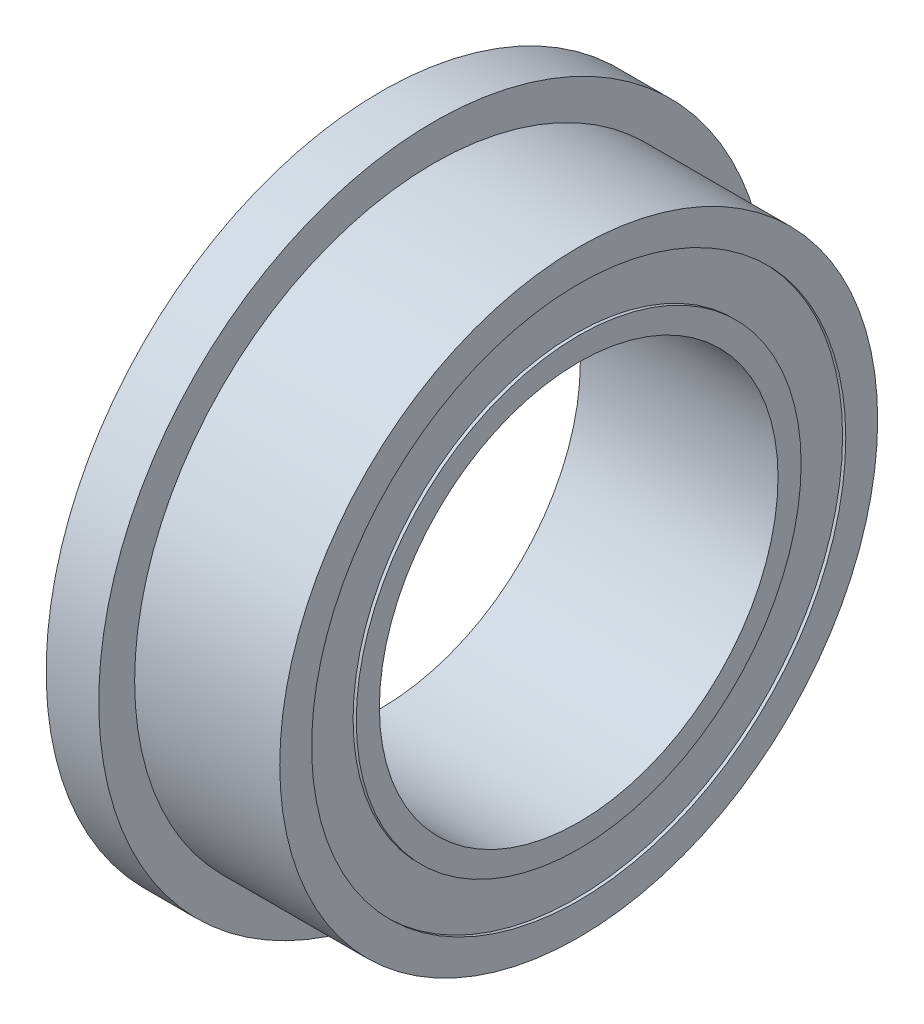
ISO-10303-21;
HEADER;
FILE_DESCRIPTION(('STEP AP214'),'2;1');
FILE_NAME('part.step','',(''),(''),'','','');
FILE_SCHEMA(('AUTOMOTIVE_DESIGN { 1 0 10303 214 1 1 1 1 }'));
ENDSEC;
DATA;
#1=APPLICATION_CONTEXT('core data for automotive mechanical design processes');
#2=APPLICATION_PROTOCOL_DEFINITION('international standard','automotive_design',2000,#1);
#3=PRODUCT_CONTEXT('',#1,'mechanical');
#4=PRODUCT('Part','Part','',(#3));
#5=PRODUCT_RELATED_PRODUCT_CATEGORY('part','',(#4));
#6=PRODUCT_DEFINITION_FORMATION('','',#4);
#7=PRODUCT_DEFINITION_CONTEXT('part definition',#1,'design');
#8=PRODUCT_DEFINITION('design','',#6,#7);
#9=PRODUCT_DEFINITION_SHAPE('','',#8);
#10=(LENGTH_UNIT() NAMED_UNIT(*) SI_UNIT(.MILLI.,.METRE.));
#11=(NAMED_UNIT(*) PLANE_ANGLE_UNIT() SI_UNIT($,.RADIAN.));
#12=(NAMED_UNIT(*) SI_UNIT($,.STERADIAN.) SOLID_ANGLE_UNIT());
#13=UNCERTAINTY_MEASURE_WITH_UNIT(LENGTH_MEASURE(1.E-05),#10,'distance_accuracy_value','');
#14=(GEOMETRIC_REPRESENTATION_CONTEXT(3) GLOBAL_UNCERTAINTY_ASSIGNED_CONTEXT((#13)) GLOBAL_UNIT_ASSIGNED_CONTEXT((#10,
#11,#12)) REPRESENTATION_CONTEXT('',''));
#15=CARTESIAN_POINT('',(0.,0.,0.));
#16=DIRECTION('',(0.,0.,1.));
#17=DIRECTION('',(1.,0.,0.));
#18=AXIS2_PLACEMENT_3D('',#15,#16,#17);
#19=CARTESIAN_POINT('',(3.1496,0.,0.));
#20=DIRECTION('',(1.,0.,0.));
#21=DIRECTION('',(0.,0.,-1.));
#22=AXIS2_PLACEMENT_3D('',#19,#20,#21);
#23=PLANE('',#22);
#24=CARTESIAN_POINT('',(3.1496,0.,0.));
#25=DIRECTION('',(1.,0.,0.));
#26=DIRECTION('',(0.,0.,-1.));
#27=AXIS2_PLACEMENT_3D('',#24,#25,#26);
#28=CIRCLE('',#27,3.175);
#29=CARTESIAN_POINT('',(3.1496,0.,-3.175));
#30=VERTEX_POINT('',#29);
#31=EDGE_CURVE('E60',#30,#30,#28,.T.);
#32=ORIENTED_EDGE('',*,*,#31,.F.);
#33=EDGE_LOOP('',(#32));
#34=FACE_BOUND('',#33,.T.);
#35=CARTESIAN_POINT('',(3.1496,0.,0.));
#36=DIRECTION('',(1.,0.,0.));
#37=DIRECTION('',(0.,0.,-1.));
#38=AXIS2_PLACEMENT_3D('',#35,#36,#37);
#39=CIRCLE('',#38,3.5433);
#40=CARTESIAN_POINT('',(3.1496,0.,-3.5433));
#41=VERTEX_POINT('',#40);
#42=EDGE_CURVE('E92',#41,#41,#39,.T.);
#43=ORIENTED_EDGE('',*,*,#42,.T.);
#44=EDGE_LOOP('',(#43));
#45=FACE_BOUND('',#44,.T.);
#46=ADVANCED_FACE('F45',(#34,#45),#23,.T.);
#47=CARTESIAN_POINT('',(0.,0.,0.));
#48=DIRECTION('',(1.,0.,0.));
#49=DIRECTION('',(0.,0.,-1.));
#50=AXIS2_PLACEMENT_3D('',#47,#48,#49);
#51=PLANE('',#50);
#52=CARTESIAN_POINT('',(0.,0.,0.));
#53=DIRECTION('',(1.,0.,0.));
#54=DIRECTION('',(0.,0.,-1.));
#55=AXIS2_PLACEMENT_3D('',#52,#53,#54);
#56=CIRCLE('',#55,3.175);
#57=CARTESIAN_POINT('',(0.,0.,-3.175));
#58=VERTEX_POINT('',#57);
#59=EDGE_CURVE('E64',#58,#58,#56,.T.);
#60=ORIENTED_EDGE('',*,*,#59,.T.);
#61=EDGE_LOOP('',(#60));
#62=FACE_BOUND('',#61,.T.);
#63=CARTESIAN_POINT('',(0.,0.,0.));
#64=DIRECTION('',(-1.,0.,0.));
#65=DIRECTION('',(0.,0.,1.));
#66=AXIS2_PLACEMENT_3D('',#63,#64,#65);
#67=CIRCLE('',#66,3.5433);
#68=CARTESIAN_POINT('',(0.,0.,3.5433));
#69=VERTEX_POINT('',#68);
#70=EDGE_CURVE('E80',#69,#69,#67,.T.);
#71=ORIENTED_EDGE('',*,*,#70,.T.);
#72=EDGE_LOOP('',(#71));
#73=FACE_BOUND('',#72,.T.);
#74=ADVANCED_FACE('F130',(#62,#73),#51,.F.);
#75=CARTESIAN_POINT('',(0.8382,0.,0.));
#76=DIRECTION('',(-1.,0.,0.));
#77=DIRECTION('',(0.,0.,1.));
#78=AXIS2_PLACEMENT_3D('',#75,#76,#77);
#79=CYLINDRICAL_SURFACE('',#78,5.334);
#80=CARTESIAN_POINT('',(0.8382,0.,0.));
#81=DIRECTION('',(1.,0.,0.));
#82=DIRECTION('',(0.,0.,-1.));
#83=AXIS2_PLACEMENT_3D('',#80,#81,#82);
#84=CIRCLE('',#83,5.334);
#85=CARTESIAN_POINT('',(0.8382,0.,-5.334));
#86=VERTEX_POINT('',#85);
#87=EDGE_CURVE('E53',#86,#86,#84,.T.);
#88=ORIENTED_EDGE('',*,*,#87,.F.);
#89=EDGE_LOOP('',(#88));
#90=FACE_BOUND('',#89,.T.);
#91=CARTESIAN_POINT('',(0.,0.,0.));
#92=DIRECTION('',(1.,0.,0.));
#93=DIRECTION('',(0.,0.,-1.));
#94=AXIS2_PLACEMENT_3D('',#91,#92,#93);
#95=CIRCLE('',#94,5.334);
#96=CARTESIAN_POINT('',(0.,0.,-5.334));
#97=VERTEX_POINT('',#96);
#98=EDGE_CURVE('E49',#97,#97,#95,.T.);
#99=ORIENTED_EDGE('',*,*,#98,.T.);
#100=EDGE_LOOP('',(#99));
#101=FACE_BOUND('',#100,.T.);
#102=ADVANCED_FACE('F47',(#90,#101),#79,.T.);
#103=CARTESIAN_POINT('',(0.8382,0.,0.));
#104=DIRECTION('',(1.,0.,0.));
#105=DIRECTION('',(0.,0.,-1.));
#106=AXIS2_PLACEMENT_3D('',#103,#104,#105);
#107=PLANE('',#106);
#108=CARTESIAN_POINT('',(0.8382,0.,0.));
#109=DIRECTION('',(1.,0.,0.));
#110=DIRECTION('',(0.,0.,-1.));
#111=AXIS2_PLACEMENT_3D('',#108,#109,#110);
#112=CIRCLE('',#111,4.7625);
#113=CARTESIAN_POINT('',(0.8382,0.,-4.7625));
#114=VERTEX_POINT('',#113);
#115=EDGE_CURVE('E11',#114,#114,#112,.T.);
#116=ORIENTED_EDGE('',*,*,#115,.F.);
#117=EDGE_LOOP('',(#116));
#118=FACE_BOUND('',#117,.T.);
#119=ORIENTED_EDGE('',*,*,#87,.T.);
#120=EDGE_LOOP('',(#119));
#121=FACE_BOUND('',#120,.T.);
#122=ADVANCED_FACE('F162',(#118,#121),#107,.T.);
#123=CARTESIAN_POINT('',(0.,0.,0.));
#124=DIRECTION('',(-1.,0.,0.));
#125=DIRECTION('',(0.,0.,1.));
#126=AXIS2_PLACEMENT_3D('',#123,#124,#125);
#127=CIRCLE('',#126,4.4069);
#128=CARTESIAN_POINT('',(0.,0.,4.4069));
#129=VERTEX_POINT('',#128);
#130=EDGE_CURVE('E74',#129,#129,#127,.T.);
#131=ORIENTED_EDGE('',*,*,#130,.F.);
#132=EDGE_LOOP('',(#131));
#133=FACE_BOUND('',#132,.T.);
#134=ORIENTED_EDGE('',*,*,#98,.F.);
#135=EDGE_LOOP('',(#134));
#136=FACE_BOUND('',#135,.T.);
#137=ADVANCED_FACE('F127',(#133,#136),#51,.F.);
#138=CARTESIAN_POINT('',(19.7695841816037,0.,0.));
#139=DIRECTION('',(-1.,0.,0.));
#140=DIRECTION('',(0.,0.,1.));
#141=AXIS2_PLACEMENT_3D('',#138,#139,#140);
#142=CYLINDRICAL_SURFACE('',#141,4.7625);
#143=ORIENTED_EDGE('',*,*,#115,.T.);
#144=EDGE_LOOP('',(#143));
#145=FACE_BOUND('',#144,.T.);
#146=CARTESIAN_POINT('',(3.1496,0.,0.));
#147=DIRECTION('',(1.,0.,0.));
#148=DIRECTION('',(0.,0.,-1.));
#149=AXIS2_PLACEMENT_3D('',#146,#147,#148);
#150=CIRCLE('',#149,4.7625);
#151=CARTESIAN_POINT('',(3.1496,0.,-4.7625));
#152=VERTEX_POINT('',#151);
#153=EDGE_CURVE('E62',#152,#152,#150,.T.);
#154=ORIENTED_EDGE('',*,*,#153,.F.);
#155=EDGE_LOOP('',(#154));
#156=FACE_BOUND('',#155,.T.);
#157=ADVANCED_FACE('F117',(#145,#156),#142,.T.);
#158=CARTESIAN_POINT('',(3.1496,0.,0.));
#159=DIRECTION('',(1.,0.,0.));
#160=DIRECTION('',(0.,0.,-1.));
#161=AXIS2_PLACEMENT_3D('',#158,#159,#160);
#162=CIRCLE('',#161,4.2545);
#163=CARTESIAN_POINT('',(3.1496,0.,-4.2545));
#164=VERTEX_POINT('',#163);
#165=EDGE_CURVE('E86',#164,#164,#162,.T.);
#166=ORIENTED_EDGE('',*,*,#165,.F.);
#167=EDGE_LOOP('',(#166));
#168=FACE_BOUND('',#167,.T.);
#169=ORIENTED_EDGE('',*,*,#153,.T.);
#170=EDGE_LOOP('',(#169));
#171=FACE_BOUND('',#170,.T.);
#172=ADVANCED_FACE('F114',(#168,#171),#23,.T.);
#173=CARTESIAN_POINT('',(0.,0.,0.));
#174=DIRECTION('',(1.,0.,0.));
#175=DIRECTION('',(0.,0.,-1.));
#176=AXIS2_PLACEMENT_3D('',#173,#174,#175);
#177=CYLINDRICAL_SURFACE('',#176,3.175);
#178=ORIENTED_EDGE('',*,*,#59,.F.);
#179=EDGE_LOOP('',(#178));
#180=FACE_BOUND('',#179,.T.);
#181=ORIENTED_EDGE('',*,*,#31,.T.);
#182=EDGE_LOOP('',(#181));
#183=FACE_BOUND('',#182,.T.);
#184=ADVANCED_FACE('F116',(#180,#183),#177,.F.);
#185=CARTESIAN_POINT('',(0.0508,0.,0.));
#186=DIRECTION('',(-1.,0.,0.));
#187=DIRECTION('',(0.,0.,1.));
#188=AXIS2_PLACEMENT_3D('',#185,#186,#187);
#189=CYLINDRICAL_SURFACE('',#188,4.4069);
#190=CARTESIAN_POINT('',(0.0508,0.,0.));
#191=DIRECTION('',(-1.,0.,0.));
#192=DIRECTION('',(0.,0.,1.));
#193=AXIS2_PLACEMENT_3D('',#190,#191,#192);
#194=CIRCLE('',#193,4.4069);
#195=CARTESIAN_POINT('',(0.0508,0.,4.4069));
#196=VERTEX_POINT('',#195);
#197=EDGE_CURVE('E72',#196,#196,#194,.T.);
#198=ORIENTED_EDGE('',*,*,#197,.F.);
#199=EDGE_LOOP('',(#198));
#200=FACE_BOUND('',#199,.T.);
#201=ORIENTED_EDGE('',*,*,#130,.T.);
#202=EDGE_LOOP('',(#201));
#203=FACE_BOUND('',#202,.T.);
#204=ADVANCED_FACE('F123',(#200,#203),#189,.F.);
#205=CARTESIAN_POINT('',(0.0508,0.,0.));
#206=DIRECTION('',(-1.,0.,0.));
#207=DIRECTION('',(0.,0.,1.));
#208=AXIS2_PLACEMENT_3D('',#205,#206,#207);
#209=PLANE('',#208);
#210=CARTESIAN_POINT('',(0.0508,0.,0.));
#211=DIRECTION('',(-1.,0.,0.));
#212=DIRECTION('',(0.,0.,1.));
#213=AXIS2_PLACEMENT_3D('',#210,#211,#212);
#214=CIRCLE('',#213,3.5433);
#215=CARTESIAN_POINT('',(0.0508,0.,3.5433));
#216=VERTEX_POINT('',#215);
#217=EDGE_CURVE('E77',#216,#216,#214,.T.);
#218=ORIENTED_EDGE('',*,*,#217,.F.);
#219=EDGE_LOOP('',(#218));
#220=FACE_BOUND('',#219,.T.);
#221=ORIENTED_EDGE('',*,*,#197,.T.);
#222=EDGE_LOOP('',(#221));
#223=FACE_BOUND('',#222,.T.);
#224=ADVANCED_FACE('F146',(#220,#223),#209,.T.);
#225=CARTESIAN_POINT('',(0.0508,0.,0.));
#226=DIRECTION('',(-1.,0.,0.));
#227=DIRECTION('',(0.,0.,1.));
#228=AXIS2_PLACEMENT_3D('',#225,#226,#227);
#229=CYLINDRICAL_SURFACE('',#228,3.5433);
#230=ORIENTED_EDGE('',*,*,#217,.T.);
#231=EDGE_LOOP('',(#230));
#232=FACE_BOUND('',#231,.T.);
#233=ORIENTED_EDGE('',*,*,#70,.F.);
#234=EDGE_LOOP('',(#233));
#235=FACE_BOUND('',#234,.T.);
#236=ADVANCED_FACE('F110',(#232,#235),#229,.T.);
#237=CARTESIAN_POINT('',(3.0988,0.,0.));
#238=DIRECTION('',(1.,0.,0.));
#239=DIRECTION('',(0.,0.,-1.));
#240=AXIS2_PLACEMENT_3D('',#237,#238,#239);
#241=CYLINDRICAL_SURFACE('',#240,4.2545);
#242=CARTESIAN_POINT('',(3.0988,0.,0.));
#243=DIRECTION('',(1.,0.,0.));
#244=DIRECTION('',(0.,0.,-1.));
#245=AXIS2_PLACEMENT_3D('',#242,#243,#244);
#246=CIRCLE('',#245,4.2545);
#247=CARTESIAN_POINT('',(3.0988,0.,-4.2545));
#248=VERTEX_POINT('',#247);
#249=EDGE_CURVE('E83',#248,#248,#246,.T.);
#250=ORIENTED_EDGE('',*,*,#249,.F.);
#251=EDGE_LOOP('',(#250));
#252=FACE_BOUND('',#251,.T.);
#253=ORIENTED_EDGE('',*,*,#165,.T.);
#254=EDGE_LOOP('',(#253));
#255=FACE_BOUND('',#254,.T.);
#256=ADVANCED_FACE('F104',(#252,#255),#241,.F.);
#257=CARTESIAN_POINT('',(3.0988,0.,0.));
#258=DIRECTION('',(1.,0.,0.));
#259=DIRECTION('',(0.,0.,-1.));
#260=AXIS2_PLACEMENT_3D('',#257,#258,#259);
#261=PLANE('',#260);
#262=CARTESIAN_POINT('',(3.0988,0.,0.));
#263=DIRECTION('',(1.,0.,0.));
#264=DIRECTION('',(0.,0.,-1.));
#265=AXIS2_PLACEMENT_3D('',#262,#263,#264);
#266=CIRCLE('',#265,3.5433);
#267=CARTESIAN_POINT('',(3.0988,0.,-3.5433));
#268=VERTEX_POINT('',#267);
#269=EDGE_CURVE('E89',#268,#268,#266,.T.);
#270=ORIENTED_EDGE('',*,*,#269,.F.);
#271=EDGE_LOOP('',(#270));
#272=FACE_BOUND('',#271,.T.);
#273=ORIENTED_EDGE('',*,*,#249,.T.);
#274=EDGE_LOOP('',(#273));
#275=FACE_BOUND('',#274,.T.);
#276=ADVANCED_FACE('F101',(#272,#275),#261,.T.);
#277=CARTESIAN_POINT('',(3.0988,0.,0.));
#278=DIRECTION('',(1.,0.,0.));
#279=DIRECTION('',(0.,0.,-1.));
#280=AXIS2_PLACEMENT_3D('',#277,#278,#279);
#281=CYLINDRICAL_SURFACE('',#280,3.5433);
#282=ORIENTED_EDGE('',*,*,#269,.T.);
#283=EDGE_LOOP('',(#282));
#284=FACE_BOUND('',#283,.T.);
#285=ORIENTED_EDGE('',*,*,#42,.F.);
#286=EDGE_LOOP('',(#285));
#287=FACE_BOUND('',#286,.T.);
#288=ADVANCED_FACE('F98',(#284,#287),#281,.T.);
#289=CLOSED_SHELL('',(#46,#74,#102,#122,#137,#157,#172,#184,#204,#224,#236,#256,#276,#288));
#290=MANIFOLD_SOLID_BREP('B2',#289);
#291=ADVANCED_BREP_SHAPE_REPRESENTATION('',(#18,#290),#14);
#292=SHAPE_DEFINITION_REPRESENTATION(#9,#291);
ENDSEC;
END-ISO-10303-21;
